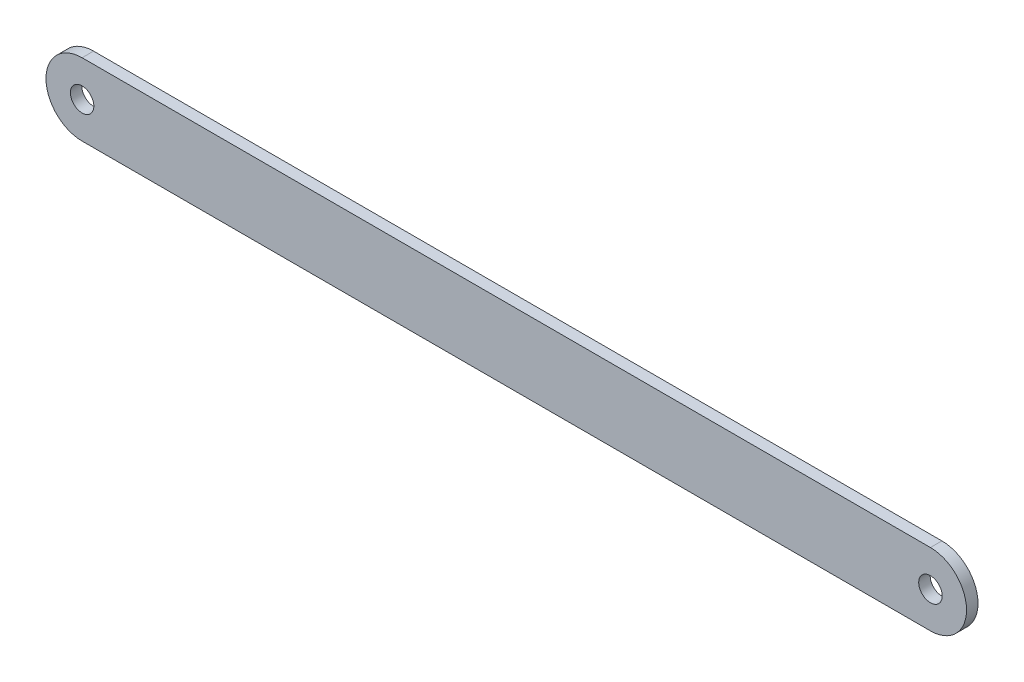
ISO-10303-21;
HEADER;
FILE_DESCRIPTION(('STEP AP214'),'2;1');
FILE_NAME('part.step','',(''),(''),'','','');
FILE_SCHEMA(('AUTOMOTIVE_DESIGN { 1 0 10303 214 1 1 1 1 }'));
ENDSEC;
DATA;
#1=APPLICATION_CONTEXT('core data for automotive mechanical design processes');
#2=APPLICATION_PROTOCOL_DEFINITION('international standard','automotive_design',2000,#1);
#3=PRODUCT_CONTEXT('',#1,'mechanical');
#4=PRODUCT('Part','Part','',(#3));
#5=PRODUCT_RELATED_PRODUCT_CATEGORY('part','',(#4));
#6=PRODUCT_DEFINITION_FORMATION('','',#4);
#7=PRODUCT_DEFINITION_CONTEXT('part definition',#1,'design');
#8=PRODUCT_DEFINITION('design','',#6,#7);
#9=PRODUCT_DEFINITION_SHAPE('','',#8);
#10=(LENGTH_UNIT() NAMED_UNIT(*) SI_UNIT(.MILLI.,.METRE.));
#11=(NAMED_UNIT(*) PLANE_ANGLE_UNIT() SI_UNIT($,.RADIAN.));
#12=(NAMED_UNIT(*) SI_UNIT($,.STERADIAN.) SOLID_ANGLE_UNIT());
#13=UNCERTAINTY_MEASURE_WITH_UNIT(LENGTH_MEASURE(1.E-05),#10,'distance_accuracy_value','');
#14=(GEOMETRIC_REPRESENTATION_CONTEXT(3) GLOBAL_UNCERTAINTY_ASSIGNED_CONTEXT((#13)) GLOBAL_UNIT_ASSIGNED_CONTEXT((#10,
#11,#12)) REPRESENTATION_CONTEXT('',''));
#15=CARTESIAN_POINT('',(0.,0.,0.));
#16=DIRECTION('',(0.,0.,1.));
#17=DIRECTION('',(1.,0.,0.));
#18=AXIS2_PLACEMENT_3D('',#15,#16,#17);
#19=CARTESIAN_POINT('',(0.,0.,3.175));
#20=DIRECTION('',(0.,0.,1.));
#21=DIRECTION('',(1.,0.,0.));
#22=AXIS2_PLACEMENT_3D('',#19,#20,#21);
#23=PLANE('',#22);
#24=CARTESIAN_POINT('',(0.,0.,3.175));
#25=DIRECTION('',(0.,0.,1.));
#26=DIRECTION('',(1.,0.,0.));
#27=AXIS2_PLACEMENT_3D('',#24,#25,#26);
#28=CIRCLE('',#27,3.25);
#29=CARTESIAN_POINT('',(3.25,0.,3.175));
#30=VERTEX_POINT('',#29);
#31=EDGE_CURVE('E100',#30,#30,#28,.T.);
#32=ORIENTED_EDGE('',*,*,#31,.F.);
#33=EDGE_LOOP('',(#32));
#34=FACE_BOUND('',#33,.T.);
#35=CARTESIAN_POINT('',(0.,0.,3.175));
#36=DIRECTION('',(0.,0.,1.));
#37=DIRECTION('',(1.,0.,0.));
#38=AXIS2_PLACEMENT_3D('',#35,#36,#37);
#39=CIRCLE('',#38,10.);
#40=CARTESIAN_POINT('',(0.,10.,3.175));
#41=VERTEX_POINT('',#40);
#42=CARTESIAN_POINT('',(0.,-10.,3.175));
#43=VERTEX_POINT('',#42);
#44=EDGE_CURVE('E85',#41,#43,#39,.T.);
#45=ORIENTED_EDGE('',*,*,#44,.T.);
#46=DIRECTION('',(1.,0.,0.));
#47=VECTOR('',#46,1.);
#48=CARTESIAN_POINT('',(0.,-10.,3.175));
#49=LINE('',#48,#47);
#50=CARTESIAN_POINT('',(235.,-10.,3.175));
#51=VERTEX_POINT('',#50);
#52=EDGE_CURVE('E80',#43,#51,#49,.T.);
#53=ORIENTED_EDGE('',*,*,#52,.T.);
#54=CARTESIAN_POINT('',(235.,0.,3.175));
#55=DIRECTION('',(0.,0.,1.));
#56=DIRECTION('',(1.,0.,0.));
#57=AXIS2_PLACEMENT_3D('',#54,#55,#56);
#58=CIRCLE('',#57,10.);
#59=CARTESIAN_POINT('',(235.,10.,3.175));
#60=VERTEX_POINT('',#59);
#61=EDGE_CURVE('E83',#51,#60,#58,.T.);
#62=ORIENTED_EDGE('',*,*,#61,.T.);
#63=DIRECTION('',(-1.,0.,0.));
#64=VECTOR('',#63,1.);
#65=CARTESIAN_POINT('',(0.,10.,3.175));
#66=LINE('',#65,#64);
#67=EDGE_CURVE('E50',#60,#41,#66,.T.);
#68=ORIENTED_EDGE('',*,*,#67,.T.);
#69=EDGE_LOOP('',(#45,#53,#62,#68));
#70=FACE_BOUND('',#69,.T.);
#71=CARTESIAN_POINT('',(235.,0.,3.175));
#72=DIRECTION('',(0.,0.,1.));
#73=DIRECTION('',(1.,0.,0.));
#74=AXIS2_PLACEMENT_3D('',#71,#72,#73);
#75=CIRCLE('',#74,3.25000000000001);
#76=CARTESIAN_POINT('',(238.25,0.,3.175));
#77=VERTEX_POINT('',#76);
#78=EDGE_CURVE('E115',#77,#77,#75,.T.);
#79=ORIENTED_EDGE('',*,*,#78,.F.);
#80=EDGE_LOOP('',(#79));
#81=FACE_BOUND('',#80,.T.);
#82=ADVANCED_FACE('F33',(#34,#70,#81),#23,.T.);
#83=CARTESIAN_POINT('',(0.,0.,0.));
#84=DIRECTION('',(0.,0.,1.));
#85=DIRECTION('',(1.,0.,0.));
#86=AXIS2_PLACEMENT_3D('',#83,#84,#85);
#87=PLANE('',#86);
#88=CARTESIAN_POINT('',(0.,0.,0.));
#89=DIRECTION('',(0.,0.,1.));
#90=DIRECTION('',(1.,0.,0.));
#91=AXIS2_PLACEMENT_3D('',#88,#89,#90);
#92=CIRCLE('',#91,10.);
#93=CARTESIAN_POINT('',(0.,10.,0.));
#94=VERTEX_POINT('',#93);
#95=CARTESIAN_POINT('',(0.,-10.,0.));
#96=VERTEX_POINT('',#95);
#97=EDGE_CURVE('E97',#94,#96,#92,.T.);
#98=ORIENTED_EDGE('',*,*,#97,.F.);
#99=DIRECTION('',(-1.,0.,0.));
#100=VECTOR('',#99,1.);
#101=CARTESIAN_POINT('',(0.,10.,0.));
#102=LINE('',#101,#100);
#103=CARTESIAN_POINT('',(235.,10.,0.));
#104=VERTEX_POINT('',#103);
#105=EDGE_CURVE('E73',#104,#94,#102,.T.);
#106=ORIENTED_EDGE('',*,*,#105,.F.);
#107=CARTESIAN_POINT('',(235.,0.,0.));
#108=DIRECTION('',(0.,0.,1.));
#109=DIRECTION('',(1.,0.,0.));
#110=AXIS2_PLACEMENT_3D('',#107,#108,#109);
#111=CIRCLE('',#110,10.);
#112=CARTESIAN_POINT('',(235.,-10.,0.));
#113=VERTEX_POINT('',#112);
#114=EDGE_CURVE('E67',#113,#104,#111,.T.);
#115=ORIENTED_EDGE('',*,*,#114,.F.);
#116=DIRECTION('',(1.,0.,0.));
#117=VECTOR('',#116,1.);
#118=CARTESIAN_POINT('',(0.,-10.,0.));
#119=LINE('',#118,#117);
#120=EDGE_CURVE('E89',#96,#113,#119,.T.);
#121=ORIENTED_EDGE('',*,*,#120,.F.);
#122=EDGE_LOOP('',(#98,#106,#115,#121));
#123=FACE_BOUND('',#122,.T.);
#124=CARTESIAN_POINT('',(0.,0.,0.));
#125=DIRECTION('',(0.,0.,1.));
#126=DIRECTION('',(1.,0.,0.));
#127=AXIS2_PLACEMENT_3D('',#124,#125,#126);
#128=CIRCLE('',#127,3.25);
#129=CARTESIAN_POINT('',(3.25,0.,0.));
#130=VERTEX_POINT('',#129);
#131=EDGE_CURVE('E112',#130,#130,#128,.T.);
#132=ORIENTED_EDGE('',*,*,#131,.T.);
#133=EDGE_LOOP('',(#132));
#134=FACE_BOUND('',#133,.T.);
#135=CARTESIAN_POINT('',(235.,0.,0.));
#136=DIRECTION('',(0.,0.,1.));
#137=DIRECTION('',(1.,0.,0.));
#138=AXIS2_PLACEMENT_3D('',#135,#136,#137);
#139=CIRCLE('',#138,3.25000000000001);
#140=CARTESIAN_POINT('',(238.25,0.,0.));
#141=VERTEX_POINT('',#140);
#142=EDGE_CURVE('E118',#141,#141,#139,.T.);
#143=ORIENTED_EDGE('',*,*,#142,.T.);
#144=EDGE_LOOP('',(#143));
#145=FACE_BOUND('',#144,.T.);
#146=ADVANCED_FACE('F108',(#123,#134,#145),#87,.F.);
#147=CARTESIAN_POINT('',(0.,0.,3.175));
#148=DIRECTION('',(0.,0.,-1.));
#149=DIRECTION('',(-1.,0.,0.));
#150=AXIS2_PLACEMENT_3D('',#147,#148,#149);
#151=CYLINDRICAL_SURFACE('',#150,10.);
#152=ORIENTED_EDGE('',*,*,#97,.T.);
#153=DIRECTION('',(0.,0.,-1.));
#154=VECTOR('',#153,1.);
#155=CARTESIAN_POINT('',(0.,-10.,3.175));
#156=LINE('',#155,#154);
#157=EDGE_CURVE('E11',#43,#96,#156,.T.);
#158=ORIENTED_EDGE('',*,*,#157,.F.);
#159=ORIENTED_EDGE('',*,*,#44,.F.);
#160=DIRECTION('',(0.,0.,-1.));
#161=VECTOR('',#160,1.);
#162=CARTESIAN_POINT('',(0.,10.,3.175));
#163=LINE('',#162,#161);
#164=EDGE_CURVE('E93',#41,#94,#163,.T.);
#165=ORIENTED_EDGE('',*,*,#164,.T.);
#166=EDGE_LOOP('',(#152,#158,#159,#165));
#167=FACE_BOUND('',#166,.T.);
#168=ADVANCED_FACE('F35',(#167),#151,.T.);
#169=CARTESIAN_POINT('',(0.,-10.,3.175));
#170=DIRECTION('',(0.,1.,0.));
#171=DIRECTION('',(0.,0.,1.));
#172=AXIS2_PLACEMENT_3D('',#169,#170,#171);
#173=PLANE('',#172);
#174=ORIENTED_EDGE('',*,*,#120,.T.);
#175=DIRECTION('',(0.,0.,-1.));
#176=VECTOR('',#175,1.);
#177=CARTESIAN_POINT('',(235.,-10.,3.175));
#178=LINE('',#177,#176);
#179=EDGE_CURVE('E42',#51,#113,#178,.T.);
#180=ORIENTED_EDGE('',*,*,#179,.F.);
#181=ORIENTED_EDGE('',*,*,#52,.F.);
#182=ORIENTED_EDGE('',*,*,#157,.T.);
#183=EDGE_LOOP('',(#174,#180,#181,#182));
#184=FACE_BOUND('',#183,.T.);
#185=ADVANCED_FACE('F88',(#184),#173,.F.);
#186=CARTESIAN_POINT('',(235.,0.,3.175));
#187=DIRECTION('',(0.,0.,-1.));
#188=DIRECTION('',(-1.,0.,0.));
#189=AXIS2_PLACEMENT_3D('',#186,#187,#188);
#190=CYLINDRICAL_SURFACE('',#189,10.);
#191=ORIENTED_EDGE('',*,*,#114,.T.);
#192=DIRECTION('',(0.,0.,-1.));
#193=VECTOR('',#192,1.);
#194=CARTESIAN_POINT('',(235.,10.,3.175));
#195=LINE('',#194,#193);
#196=EDGE_CURVE('E90',#60,#104,#195,.T.);
#197=ORIENTED_EDGE('',*,*,#196,.F.);
#198=ORIENTED_EDGE('',*,*,#61,.F.);
#199=ORIENTED_EDGE('',*,*,#179,.T.);
#200=EDGE_LOOP('',(#191,#197,#198,#199));
#201=FACE_BOUND('',#200,.T.);
#202=ADVANCED_FACE('F91',(#201),#190,.T.);
#203=CARTESIAN_POINT('',(0.,10.,3.175));
#204=DIRECTION('',(0.,-1.,0.));
#205=DIRECTION('',(0.,0.,-1.));
#206=AXIS2_PLACEMENT_3D('',#203,#204,#205);
#207=PLANE('',#206);
#208=ORIENTED_EDGE('',*,*,#105,.T.);
#209=ORIENTED_EDGE('',*,*,#164,.F.);
#210=ORIENTED_EDGE('',*,*,#67,.F.);
#211=ORIENTED_EDGE('',*,*,#196,.T.);
#212=EDGE_LOOP('',(#208,#209,#210,#211));
#213=FACE_BOUND('',#212,.T.);
#214=ADVANCED_FACE('F105',(#213),#207,.F.);
#215=CARTESIAN_POINT('',(0.,0.,3.175));
#216=DIRECTION('',(0.,0.,-1.));
#217=DIRECTION('',(-1.,0.,0.));
#218=AXIS2_PLACEMENT_3D('',#215,#216,#217);
#219=CYLINDRICAL_SURFACE('',#218,3.25);
#220=ORIENTED_EDGE('',*,*,#31,.T.);
#221=EDGE_LOOP('',(#220));
#222=FACE_BOUND('',#221,.T.);
#223=ORIENTED_EDGE('',*,*,#131,.F.);
#224=EDGE_LOOP('',(#223));
#225=FACE_BOUND('',#224,.T.);
#226=ADVANCED_FACE('F135',(#222,#225),#219,.F.);
#227=CARTESIAN_POINT('',(235.,0.,3.175));
#228=DIRECTION('',(0.,0.,-1.));
#229=DIRECTION('',(-1.,0.,0.));
#230=AXIS2_PLACEMENT_3D('',#227,#228,#229);
#231=CYLINDRICAL_SURFACE('',#230,3.25000000000001);
#232=ORIENTED_EDGE('',*,*,#78,.T.);
#233=EDGE_LOOP('',(#232));
#234=FACE_BOUND('',#233,.T.);
#235=ORIENTED_EDGE('',*,*,#142,.F.);
#236=EDGE_LOOP('',(#235));
#237=FACE_BOUND('',#236,.T.);
#238=ADVANCED_FACE('F124',(#234,#237),#231,.F.);
#239=CLOSED_SHELL('',(#82,#146,#168,#185,#202,#214,#226,#238));
#240=MANIFOLD_SOLID_BREP('B2',#239);
#241=ADVANCED_BREP_SHAPE_REPRESENTATION('',(#18,#240),#14);
#242=SHAPE_DEFINITION_REPRESENTATION(#9,#241);
ENDSEC;
END-ISO-10303-21;
